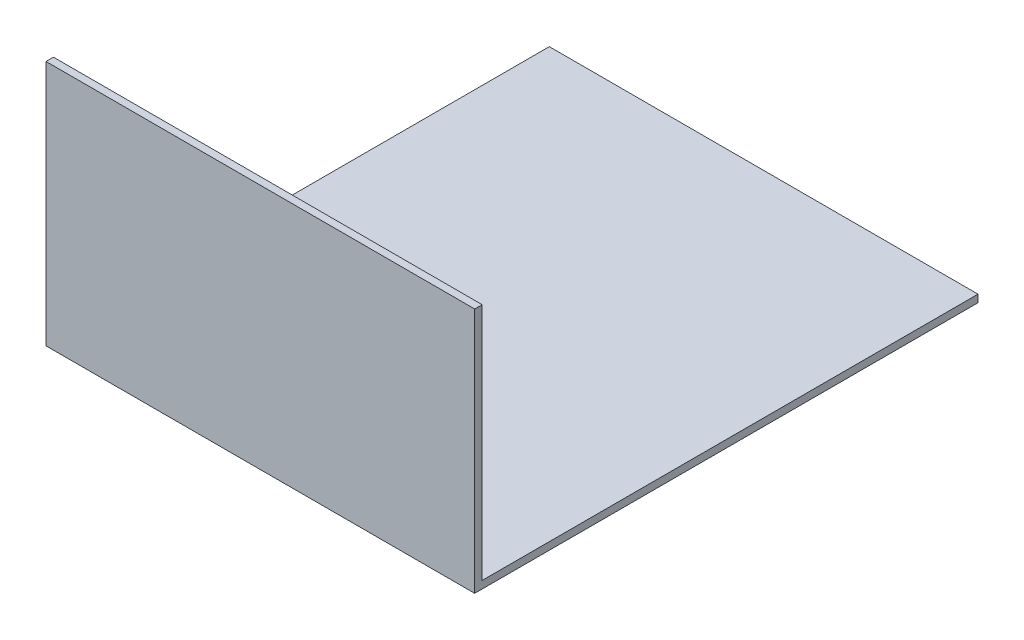
ISO-10303-21;
HEADER;
FILE_DESCRIPTION(('STEP AP214'),'2;1');
FILE_NAME('part.step','',(''),(''),'','','');
FILE_SCHEMA(('AUTOMOTIVE_DESIGN { 1 0 10303 214 1 1 1 1 }'));
ENDSEC;
DATA;
#1=APPLICATION_CONTEXT('core data for automotive mechanical design processes');
#2=APPLICATION_PROTOCOL_DEFINITION('international standard','automotive_design',2000,#1);
#3=PRODUCT_CONTEXT('',#1,'mechanical');
#4=PRODUCT('Part','Part','',(#3));
#5=PRODUCT_RELATED_PRODUCT_CATEGORY('part','',(#4));
#6=PRODUCT_DEFINITION_FORMATION('','',#4);
#7=PRODUCT_DEFINITION_CONTEXT('part definition',#1,'design');
#8=PRODUCT_DEFINITION('design','',#6,#7);
#9=PRODUCT_DEFINITION_SHAPE('','',#8);
#10=(LENGTH_UNIT() NAMED_UNIT(*) SI_UNIT(.MILLI.,.METRE.));
#11=(NAMED_UNIT(*) PLANE_ANGLE_UNIT() SI_UNIT($,.RADIAN.));
#12=(NAMED_UNIT(*) SI_UNIT($,.STERADIAN.) SOLID_ANGLE_UNIT());
#13=UNCERTAINTY_MEASURE_WITH_UNIT(LENGTH_MEASURE(1.E-05),#10,'distance_accuracy_value','');
#14=(GEOMETRIC_REPRESENTATION_CONTEXT(3) GLOBAL_UNCERTAINTY_ASSIGNED_CONTEXT((#13)) GLOBAL_UNIT_ASSIGNED_CONTEXT((#10,
#11,#12)) REPRESENTATION_CONTEXT('',''));
#15=CARTESIAN_POINT('',(0.,0.,0.));
#16=DIRECTION('',(0.,0.,1.));
#17=DIRECTION('',(1.,0.,0.));
#18=AXIS2_PLACEMENT_3D('',#15,#16,#17);
#19=CARTESIAN_POINT('',(0.,5.,0.));
#20=DIRECTION('',(0.,-1.,0.));
#21=DIRECTION('',(0.,0.,-1.));
#22=AXIS2_PLACEMENT_3D('',#19,#20,#21);
#23=PLANE('',#22);
#24=DIRECTION('',(-1.,0.,0.));
#25=VECTOR('',#24,1.);
#26=CARTESIAN_POINT('',(-143.600000000001,5.,163.600000000001));
#27=LINE('',#26,#25);
#28=CARTESIAN_POINT('',(143.599999999999,5.,163.600000000001));
#29=VERTEX_POINT('',#28);
#30=CARTESIAN_POINT('',(-143.600000000001,5.,163.600000000001));
#31=VERTEX_POINT('',#30);
#32=EDGE_CURVE('E49',#29,#31,#27,.T.);
#33=ORIENTED_EDGE('',*,*,#32,.F.);
#34=DIRECTION('',(0.,0.,-1.));
#35=VECTOR('',#34,1.);
#36=CARTESIAN_POINT('',(143.599999999999,5.,168.600000000001));
#37=LINE('',#36,#35);
#38=CARTESIAN_POINT('',(143.599999999999,5.,-168.6));
#39=VERTEX_POINT('',#38);
#40=EDGE_CURVE('E87',#29,#39,#37,.T.);
#41=ORIENTED_EDGE('',*,*,#40,.T.);
#42=DIRECTION('',(-1.,0.,0.));
#43=VECTOR('',#42,1.);
#44=CARTESIAN_POINT('',(-143.600000000001,5.,-168.6));
#45=LINE('',#44,#43);
#46=CARTESIAN_POINT('',(-143.600000000001,5.,-168.6));
#47=VERTEX_POINT('',#46);
#48=EDGE_CURVE('E55',#39,#47,#45,.T.);
#49=ORIENTED_EDGE('',*,*,#48,.T.);
#50=DIRECTION('',(0.,0.,1.));
#51=VECTOR('',#50,1.);
#52=CARTESIAN_POINT('',(-143.600000000001,5.,168.600000000001));
#53=LINE('',#52,#51);
#54=EDGE_CURVE('E98',#47,#31,#53,.T.);
#55=ORIENTED_EDGE('',*,*,#54,.T.);
#56=EDGE_LOOP('',(#33,#41,#49,#55));
#57=FACE_BOUND('',#56,.T.);
#58=ADVANCED_FACE('F32',(#57),#23,.F.);
#59=CARTESIAN_POINT('',(143.599999999999,5.,168.600000000001));
#60=DIRECTION('',(-1.,0.,0.));
#61=DIRECTION('',(0.,0.,1.));
#62=AXIS2_PLACEMENT_3D('',#59,#60,#61);
#63=PLANE('',#62);
#64=DIRECTION('',(0.,0.,-1.));
#65=VECTOR('',#64,1.);
#66=CARTESIAN_POINT('',(143.599999999999,0.,168.600000000001));
#67=LINE('',#66,#65);
#68=CARTESIAN_POINT('',(143.599999999999,0.,168.600000000001));
#69=VERTEX_POINT('',#68);
#70=CARTESIAN_POINT('',(143.599999999999,0.,-168.6));
#71=VERTEX_POINT('',#70);
#72=EDGE_CURVE('E94',#69,#71,#67,.T.);
#73=ORIENTED_EDGE('',*,*,#72,.T.);
#74=DIRECTION('',(0.,-1.,0.));
#75=VECTOR('',#74,1.);
#76=CARTESIAN_POINT('',(143.599999999999,5.,-168.6));
#77=LINE('',#76,#75);
#78=EDGE_CURVE('E11',#39,#71,#77,.T.);
#79=ORIENTED_EDGE('',*,*,#78,.F.);
#80=ORIENTED_EDGE('',*,*,#40,.F.);
#81=DIRECTION('',(0.,-1.,0.));
#82=VECTOR('',#81,1.);
#83=CARTESIAN_POINT('',(143.599999999999,165.,163.600000000001));
#84=LINE('',#83,#82);
#85=CARTESIAN_POINT('',(143.599999999999,165.,163.600000000001));
#86=VERTEX_POINT('',#85);
#87=EDGE_CURVE('E102',#86,#29,#84,.T.);
#88=ORIENTED_EDGE('',*,*,#87,.F.);
#89=DIRECTION('',(0.,0.,-1.));
#90=VECTOR('',#89,1.);
#91=CARTESIAN_POINT('',(143.599999999999,165.,163.600000000001));
#92=LINE('',#91,#90);
#93=CARTESIAN_POINT('',(143.599999999999,165.,168.600000000001));
#94=VERTEX_POINT('',#93);
#95=EDGE_CURVE('E97',#94,#86,#92,.T.);
#96=ORIENTED_EDGE('',*,*,#95,.F.);
#97=DIRECTION('',(0.,-1.,0.));
#98=VECTOR('',#97,1.);
#99=CARTESIAN_POINT('',(143.599999999999,5.,168.600000000001));
#100=LINE('',#99,#98);
#101=EDGE_CURVE('E80',#94,#69,#100,.T.);
#102=ORIENTED_EDGE('',*,*,#101,.T.);
#103=EDGE_LOOP('',(#73,#79,#80,#88,#96,#102));
#104=FACE_BOUND('',#103,.T.);
#105=ADVANCED_FACE('F34',(#104),#63,.F.);
#106=CARTESIAN_POINT('',(-143.600000000001,5.,-168.6));
#107=DIRECTION('',(0.,0.,1.));
#108=DIRECTION('',(1.,0.,0.));
#109=AXIS2_PLACEMENT_3D('',#106,#107,#108);
#110=PLANE('',#109);
#111=DIRECTION('',(-1.,0.,0.));
#112=VECTOR('',#111,1.);
#113=CARTESIAN_POINT('',(-143.600000000001,0.,-168.6));
#114=LINE('',#113,#112);
#115=CARTESIAN_POINT('',(-143.600000000001,0.,-168.6));
#116=VERTEX_POINT('',#115);
#117=EDGE_CURVE('E101',#71,#116,#114,.T.);
#118=ORIENTED_EDGE('',*,*,#117,.T.);
#119=DIRECTION('',(0.,-1.,0.));
#120=VECTOR('',#119,1.);
#121=CARTESIAN_POINT('',(-143.600000000001,5.,-168.6));
#122=LINE('',#121,#120);
#123=EDGE_CURVE('E41',#47,#116,#122,.T.);
#124=ORIENTED_EDGE('',*,*,#123,.F.);
#125=ORIENTED_EDGE('',*,*,#48,.F.);
#126=ORIENTED_EDGE('',*,*,#78,.T.);
#127=EDGE_LOOP('',(#118,#124,#125,#126));
#128=FACE_BOUND('',#127,.T.);
#129=ADVANCED_FACE('F152',(#128),#110,.F.);
#130=CARTESIAN_POINT('',(-143.600000000001,5.,168.600000000001));
#131=DIRECTION('',(1.,0.,0.));
#132=DIRECTION('',(0.,0.,-1.));
#133=AXIS2_PLACEMENT_3D('',#130,#131,#132);
#134=PLANE('',#133);
#135=DIRECTION('',(0.,0.,1.));
#136=VECTOR('',#135,1.);
#137=CARTESIAN_POINT('',(-143.600000000001,0.,168.600000000001));
#138=LINE('',#137,#136);
#139=CARTESIAN_POINT('',(-143.600000000001,0.,168.600000000001));
#140=VERTEX_POINT('',#139);
#141=EDGE_CURVE('E88',#116,#140,#138,.T.);
#142=ORIENTED_EDGE('',*,*,#141,.T.);
#143=DIRECTION('',(0.,-1.,0.));
#144=VECTOR('',#143,1.);
#145=CARTESIAN_POINT('',(-143.600000000001,5.,168.600000000001));
#146=LINE('',#145,#144);
#147=CARTESIAN_POINT('',(-143.600000000001,165.,168.600000000001));
#148=VERTEX_POINT('',#147);
#149=EDGE_CURVE('E83',#148,#140,#146,.T.);
#150=ORIENTED_EDGE('',*,*,#149,.F.);
#151=DIRECTION('',(0.,0.,1.));
#152=VECTOR('',#151,1.);
#153=CARTESIAN_POINT('',(-143.600000000001,165.,163.600000000001));
#154=LINE('',#153,#152);
#155=CARTESIAN_POINT('',(-143.600000000001,165.,163.600000000001));
#156=VERTEX_POINT('',#155);
#157=EDGE_CURVE('E132',#156,#148,#154,.T.);
#158=ORIENTED_EDGE('',*,*,#157,.F.);
#159=DIRECTION('',(0.,-1.,0.));
#160=VECTOR('',#159,1.);
#161=CARTESIAN_POINT('',(-143.600000000001,165.,163.600000000001));
#162=LINE('',#161,#160);
#163=EDGE_CURVE('E106',#156,#31,#162,.T.);
#164=ORIENTED_EDGE('',*,*,#163,.T.);
#165=ORIENTED_EDGE('',*,*,#54,.F.);
#166=ORIENTED_EDGE('',*,*,#123,.T.);
#167=EDGE_LOOP('',(#142,#150,#158,#164,#165,#166));
#168=FACE_BOUND('',#167,.T.);
#169=ADVANCED_FACE('F133',(#168),#134,.F.);
#170=CARTESIAN_POINT('',(-143.600000000001,5.,168.600000000001));
#171=DIRECTION('',(0.,0.,-1.));
#172=DIRECTION('',(-1.,0.,0.));
#173=AXIS2_PLACEMENT_3D('',#170,#171,#172);
#174=PLANE('',#173);
#175=DIRECTION('',(1.,0.,0.));
#176=VECTOR('',#175,1.);
#177=CARTESIAN_POINT('',(-143.600000000001,0.,168.600000000001));
#178=LINE('',#177,#176);
#179=EDGE_CURVE('E75',#140,#69,#178,.T.);
#180=ORIENTED_EDGE('',*,*,#179,.T.);
#181=ORIENTED_EDGE('',*,*,#101,.F.);
#182=DIRECTION('',(1.,0.,0.));
#183=VECTOR('',#182,1.);
#184=CARTESIAN_POINT('',(-143.600000000001,165.,168.600000000001));
#185=LINE('',#184,#183);
#186=EDGE_CURVE('E141',#148,#94,#185,.T.);
#187=ORIENTED_EDGE('',*,*,#186,.F.);
#188=ORIENTED_EDGE('',*,*,#149,.T.);
#189=EDGE_LOOP('',(#180,#181,#187,#188));
#190=FACE_BOUND('',#189,.T.);
#191=ADVANCED_FACE('F77',(#190),#174,.F.);
#192=CARTESIAN_POINT('',(0.,0.,0.));
#193=DIRECTION('',(0.,-1.,0.));
#194=DIRECTION('',(0.,0.,-1.));
#195=AXIS2_PLACEMENT_3D('',#192,#193,#194);
#196=PLANE('',#195);
#197=ORIENTED_EDGE('',*,*,#72,.F.);
#198=ORIENTED_EDGE('',*,*,#179,.F.);
#199=ORIENTED_EDGE('',*,*,#141,.F.);
#200=ORIENTED_EDGE('',*,*,#117,.F.);
#201=EDGE_LOOP('',(#197,#198,#199,#200));
#202=FACE_BOUND('',#201,.T.);
#203=ADVANCED_FACE('F100',(#202),#196,.T.);
#204=CARTESIAN_POINT('',(-143.600000000001,165.,163.600000000001));
#205=DIRECTION('',(0.,0.,1.));
#206=DIRECTION('',(1.,0.,0.));
#207=AXIS2_PLACEMENT_3D('',#204,#205,#206);
#208=PLANE('',#207);
#209=ORIENTED_EDGE('',*,*,#32,.T.);
#210=ORIENTED_EDGE('',*,*,#163,.F.);
#211=DIRECTION('',(-1.,0.,0.));
#212=VECTOR('',#211,1.);
#213=CARTESIAN_POINT('',(-143.600000000001,165.,163.600000000001));
#214=LINE('',#213,#212);
#215=EDGE_CURVE('E135',#86,#156,#214,.T.);
#216=ORIENTED_EDGE('',*,*,#215,.F.);
#217=ORIENTED_EDGE('',*,*,#87,.T.);
#218=EDGE_LOOP('',(#209,#210,#216,#217));
#219=FACE_BOUND('',#218,.T.);
#220=ADVANCED_FACE('F129',(#219),#208,.F.);
#221=CARTESIAN_POINT('',(0.,165.,0.));
#222=DIRECTION('',(0.,1.,0.));
#223=DIRECTION('',(0.,0.,1.));
#224=AXIS2_PLACEMENT_3D('',#221,#222,#223);
#225=PLANE('',#224);
#226=ORIENTED_EDGE('',*,*,#157,.T.);
#227=ORIENTED_EDGE('',*,*,#186,.T.);
#228=ORIENTED_EDGE('',*,*,#95,.T.);
#229=ORIENTED_EDGE('',*,*,#215,.T.);
#230=EDGE_LOOP('',(#226,#227,#228,#229));
#231=FACE_BOUND('',#230,.T.);
#232=ADVANCED_FACE('F145',(#231),#225,.T.);
#233=CLOSED_SHELL('',(#58,#105,#129,#169,#191,#203,#220,#232));
#234=MANIFOLD_SOLID_BREP('B2',#233);
#235=ADVANCED_BREP_SHAPE_REPRESENTATION('',(#18,#234),#14);
#236=SHAPE_DEFINITION_REPRESENTATION(#9,#235);
ENDSEC;
END-ISO-10303-21;
